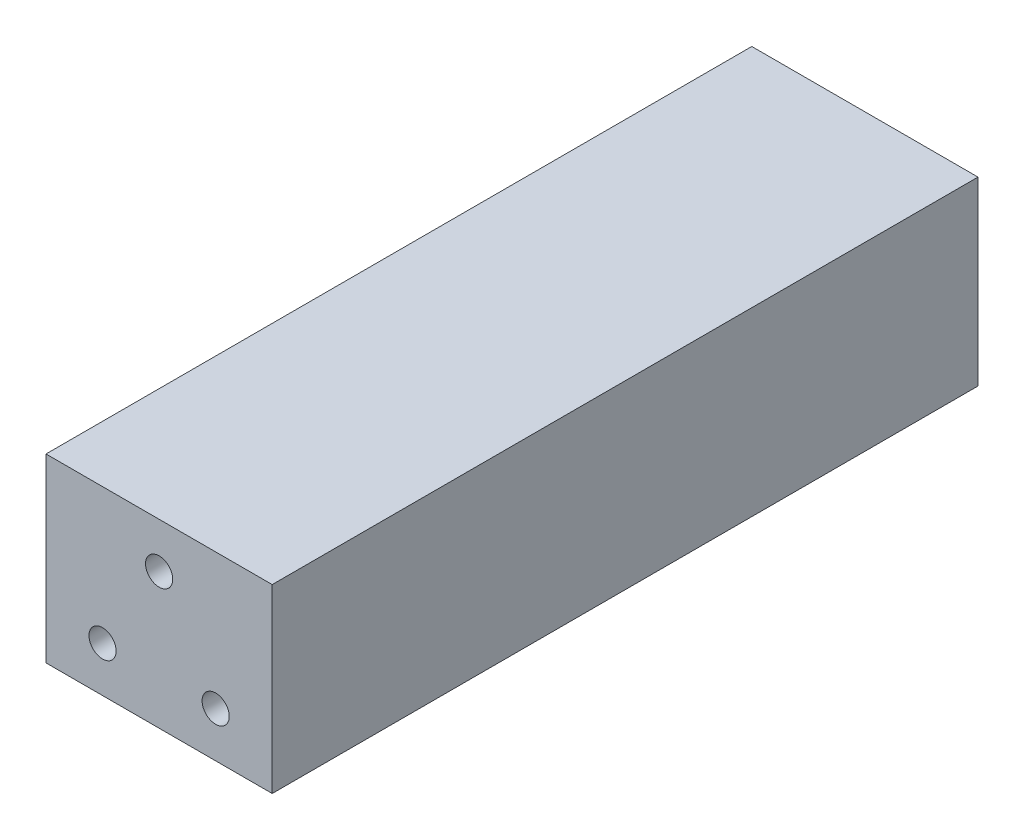
ISO-10303-21;
HEADER;
FILE_DESCRIPTION(('STEP AP214'),'2;1');
FILE_NAME('part.step','',(''),(''),'','','');
FILE_SCHEMA(('AUTOMOTIVE_DESIGN { 1 0 10303 214 1 1 1 1 }'));
ENDSEC;
DATA;
#1=APPLICATION_CONTEXT('core data for automotive mechanical design processes');
#2=APPLICATION_PROTOCOL_DEFINITION('international standard','automotive_design',2000,#1);
#3=PRODUCT_CONTEXT('',#1,'mechanical');
#4=PRODUCT('Part','Part','',(#3));
#5=PRODUCT_RELATED_PRODUCT_CATEGORY('part','',(#4));
#6=PRODUCT_DEFINITION_FORMATION('','',#4);
#7=PRODUCT_DEFINITION_CONTEXT('part definition',#1,'design');
#8=PRODUCT_DEFINITION('design','',#6,#7);
#9=PRODUCT_DEFINITION_SHAPE('','',#8);
#10=(LENGTH_UNIT() NAMED_UNIT(*) SI_UNIT(.MILLI.,.METRE.));
#11=(NAMED_UNIT(*) PLANE_ANGLE_UNIT() SI_UNIT($,.RADIAN.));
#12=(NAMED_UNIT(*) SI_UNIT($,.STERADIAN.) SOLID_ANGLE_UNIT());
#13=UNCERTAINTY_MEASURE_WITH_UNIT(LENGTH_MEASURE(1.E-05),#10,'distance_accuracy_value','');
#14=(GEOMETRIC_REPRESENTATION_CONTEXT(3) GLOBAL_UNCERTAINTY_ASSIGNED_CONTEXT((#13)) GLOBAL_UNIT_ASSIGNED_CONTEXT((#10,
#11,#12)) REPRESENTATION_CONTEXT('',''));
#15=CARTESIAN_POINT('',(0.,0.,0.));
#16=DIRECTION('',(0.,0.,1.));
#17=DIRECTION('',(1.,0.,0.));
#18=AXIS2_PLACEMENT_3D('',#15,#16,#17);
#19=CARTESIAN_POINT('',(0.,0.,78.0000000000001));
#20=DIRECTION('',(1.,0.,0.));
#21=DIRECTION('',(0.,1.,0.));
#22=AXIS2_PLACEMENT_3D('',#19,#20,#21);
#23=PLANE('',#22);
#24=DIRECTION('',(0.,-1.,0.));
#25=VECTOR('',#24,1.);
#26=CARTESIAN_POINT('',(0.,0.,0.));
#27=LINE('',#26,#25);
#28=CARTESIAN_POINT('',(0.,0.,0.));
#29=VERTEX_POINT('',#28);
#30=CARTESIAN_POINT('',(0.,-20.,0.));
#31=VERTEX_POINT('',#30);
#32=EDGE_CURVE('E98',#29,#31,#27,.T.);
#33=ORIENTED_EDGE('',*,*,#32,.T.);
#34=DIRECTION('',(0.,0.,-1.));
#35=VECTOR('',#34,1.);
#36=CARTESIAN_POINT('',(0.,-20.,78.0000000000001));
#37=LINE('',#36,#35);
#38=CARTESIAN_POINT('',(0.,-20.,78.0000000000001));
#39=VERTEX_POINT('',#38);
#40=EDGE_CURVE('E11',#39,#31,#37,.T.);
#41=ORIENTED_EDGE('',*,*,#40,.F.);
#42=DIRECTION('',(0.,-1.,0.));
#43=VECTOR('',#42,1.);
#44=CARTESIAN_POINT('',(0.,0.,78.0000000000001));
#45=LINE('',#44,#43);
#46=CARTESIAN_POINT('',(0.,0.,78.0000000000001));
#47=VERTEX_POINT('',#46);
#48=EDGE_CURVE('E86',#47,#39,#45,.T.);
#49=ORIENTED_EDGE('',*,*,#48,.F.);
#50=DIRECTION('',(0.,0.,-1.));
#51=VECTOR('',#50,1.);
#52=CARTESIAN_POINT('',(0.,0.,78.0000000000001));
#53=LINE('',#52,#51);
#54=EDGE_CURVE('E94',#47,#29,#53,.T.);
#55=ORIENTED_EDGE('',*,*,#54,.T.);
#56=EDGE_LOOP('',(#33,#41,#49,#55));
#57=FACE_BOUND('',#56,.T.);
#58=ADVANCED_FACE('F35',(#57),#23,.F.);
#59=CARTESIAN_POINT('',(0.,-20.,78.0000000000001));
#60=DIRECTION('',(0.,1.,0.));
#61=DIRECTION('',(0.,0.,1.));
#62=AXIS2_PLACEMENT_3D('',#59,#60,#61);
#63=PLANE('',#62);
#64=DIRECTION('',(1.,0.,0.));
#65=VECTOR('',#64,1.);
#66=CARTESIAN_POINT('',(0.,-20.,0.));
#67=LINE('',#66,#65);
#68=CARTESIAN_POINT('',(25.,-20.,0.));
#69=VERTEX_POINT('',#68);
#70=EDGE_CURVE('E90',#31,#69,#67,.T.);
#71=ORIENTED_EDGE('',*,*,#70,.T.);
#72=DIRECTION('',(0.,0.,-1.));
#73=VECTOR('',#72,1.);
#74=CARTESIAN_POINT('',(25.,-20.,78.0000000000001));
#75=LINE('',#74,#73);
#76=CARTESIAN_POINT('',(25.,-20.,78.0000000000001));
#77=VERTEX_POINT('',#76);
#78=EDGE_CURVE('E43',#77,#69,#75,.T.);
#79=ORIENTED_EDGE('',*,*,#78,.F.);
#80=DIRECTION('',(1.,0.,0.));
#81=VECTOR('',#80,1.);
#82=CARTESIAN_POINT('',(0.,-20.,78.0000000000001));
#83=LINE('',#82,#81);
#84=EDGE_CURVE('E81',#39,#77,#83,.T.);
#85=ORIENTED_EDGE('',*,*,#84,.F.);
#86=ORIENTED_EDGE('',*,*,#40,.T.);
#87=EDGE_LOOP('',(#71,#79,#85,#86));
#88=FACE_BOUND('',#87,.T.);
#89=ADVANCED_FACE('F89',(#88),#63,.F.);
#90=CARTESIAN_POINT('',(25.,0.,78.0000000000001));
#91=DIRECTION('',(-1.,0.,0.));
#92=DIRECTION('',(0.,0.,1.));
#93=AXIS2_PLACEMENT_3D('',#90,#91,#92);
#94=PLANE('',#93);
#95=DIRECTION('',(0.,1.,0.));
#96=VECTOR('',#95,1.);
#97=CARTESIAN_POINT('',(25.,0.,0.));
#98=LINE('',#97,#96);
#99=CARTESIAN_POINT('',(25.,0.,0.));
#100=VERTEX_POINT('',#99);
#101=EDGE_CURVE('E68',#69,#100,#98,.T.);
#102=ORIENTED_EDGE('',*,*,#101,.T.);
#103=DIRECTION('',(0.,0.,-1.));
#104=VECTOR('',#103,1.);
#105=CARTESIAN_POINT('',(25.,0.,78.0000000000001));
#106=LINE('',#105,#104);
#107=CARTESIAN_POINT('',(25.,0.,78.0000000000001));
#108=VERTEX_POINT('',#107);
#109=EDGE_CURVE('E91',#108,#100,#106,.T.);
#110=ORIENTED_EDGE('',*,*,#109,.F.);
#111=DIRECTION('',(0.,1.,0.));
#112=VECTOR('',#111,1.);
#113=CARTESIAN_POINT('',(25.,0.,78.0000000000001));
#114=LINE('',#113,#112);
#115=EDGE_CURVE('E84',#77,#108,#114,.T.);
#116=ORIENTED_EDGE('',*,*,#115,.F.);
#117=ORIENTED_EDGE('',*,*,#78,.T.);
#118=EDGE_LOOP('',(#102,#110,#116,#117));
#119=FACE_BOUND('',#118,.T.);
#120=ADVANCED_FACE('F92',(#119),#94,.F.);
#121=CARTESIAN_POINT('',(0.,0.,78.0000000000001));
#122=DIRECTION('',(0.,-1.,0.));
#123=DIRECTION('',(0.,0.,-1.));
#124=AXIS2_PLACEMENT_3D('',#121,#122,#123);
#125=PLANE('',#124);
#126=DIRECTION('',(-1.,0.,0.));
#127=VECTOR('',#126,1.);
#128=CARTESIAN_POINT('',(0.,0.,0.));
#129=LINE('',#128,#127);
#130=EDGE_CURVE('E74',#100,#29,#129,.T.);
#131=ORIENTED_EDGE('',*,*,#130,.T.);
#132=ORIENTED_EDGE('',*,*,#54,.F.);
#133=DIRECTION('',(-1.,0.,0.));
#134=VECTOR('',#133,1.);
#135=CARTESIAN_POINT('',(0.,0.,78.0000000000001));
#136=LINE('',#135,#134);
#137=EDGE_CURVE('E51',#108,#47,#136,.T.);
#138=ORIENTED_EDGE('',*,*,#137,.F.);
#139=ORIENTED_EDGE('',*,*,#109,.T.);
#140=EDGE_LOOP('',(#131,#132,#138,#139));
#141=FACE_BOUND('',#140,.T.);
#142=ADVANCED_FACE('F106',(#141),#125,.F.);
#143=CARTESIAN_POINT('',(0.,0.,78.0000000000001));
#144=DIRECTION('',(0.,0.,1.));
#145=DIRECTION('',(1.,0.,0.));
#146=AXIS2_PLACEMENT_3D('',#143,#144,#145);
#147=PLANE('',#146);
#148=CARTESIAN_POINT('',(12.5,-5.,78.0000000000001));
#149=DIRECTION('',(0.,0.,1.));
#150=DIRECTION('',(1.,0.,0.));
#151=AXIS2_PLACEMENT_3D('',#148,#149,#150);
#152=CIRCLE('',#151,1.5);
#153=CARTESIAN_POINT('',(14.,-5.,78.0000000000001));
#154=VERTEX_POINT('',#153);
#155=EDGE_CURVE('E125',#154,#154,#152,.T.);
#156=ORIENTED_EDGE('',*,*,#155,.F.);
#157=EDGE_LOOP('',(#156));
#158=FACE_BOUND('',#157,.T.);
#159=CARTESIAN_POINT('',(6.25,-15.,78.0000000000001));
#160=DIRECTION('',(0.,0.,1.));
#161=DIRECTION('',(1.,0.,0.));
#162=AXIS2_PLACEMENT_3D('',#159,#160,#161);
#163=CIRCLE('',#162,1.5);
#164=CARTESIAN_POINT('',(7.75,-15.,78.0000000000001));
#165=VERTEX_POINT('',#164);
#166=EDGE_CURVE('E119',#165,#165,#163,.T.);
#167=ORIENTED_EDGE('',*,*,#166,.F.);
#168=EDGE_LOOP('',(#167));
#169=FACE_BOUND('',#168,.T.);
#170=CARTESIAN_POINT('',(18.75,-15.,78.0000000000001));
#171=DIRECTION('',(0.,0.,1.));
#172=DIRECTION('',(1.,0.,0.));
#173=AXIS2_PLACEMENT_3D('',#170,#171,#172);
#174=CIRCLE('',#173,1.5);
#175=CARTESIAN_POINT('',(20.25,-15.,78.0000000000001));
#176=VERTEX_POINT('',#175);
#177=EDGE_CURVE('E112',#176,#176,#174,.T.);
#178=ORIENTED_EDGE('',*,*,#177,.F.);
#179=EDGE_LOOP('',(#178));
#180=FACE_BOUND('',#179,.T.);
#181=ORIENTED_EDGE('',*,*,#48,.T.);
#182=ORIENTED_EDGE('',*,*,#84,.T.);
#183=ORIENTED_EDGE('',*,*,#115,.T.);
#184=ORIENTED_EDGE('',*,*,#137,.T.);
#185=EDGE_LOOP('',(#181,#182,#183,#184));
#186=FACE_BOUND('',#185,.T.);
#187=ADVANCED_FACE('F82',(#158,#169,#180,#186),#147,.T.);
#188=CARTESIAN_POINT('',(0.,0.,0.));
#189=DIRECTION('',(0.,0.,1.));
#190=DIRECTION('',(1.,0.,0.));
#191=AXIS2_PLACEMENT_3D('',#188,#189,#190);
#192=PLANE('',#191);
#193=CARTESIAN_POINT('',(12.5,-5.,0.));
#194=DIRECTION('',(0.,0.,-1.));
#195=DIRECTION('',(-1.,0.,0.));
#196=AXIS2_PLACEMENT_3D('',#193,#194,#195);
#197=CIRCLE('',#196,1.48552314686929);
#198=CARTESIAN_POINT('',(11.0144768531307,-5.,0.));
#199=VERTEX_POINT('',#198);
#200=EDGE_CURVE('E142',#199,#199,#197,.T.);
#201=ORIENTED_EDGE('',*,*,#200,.F.);
#202=EDGE_LOOP('',(#201));
#203=FACE_BOUND('',#202,.T.);
#204=CARTESIAN_POINT('',(6.25,-15.,0.));
#205=DIRECTION('',(0.,0.,-1.));
#206=DIRECTION('',(-1.,0.,0.));
#207=AXIS2_PLACEMENT_3D('',#204,#205,#206);
#208=CIRCLE('',#207,1.54736061569707);
#209=CARTESIAN_POINT('',(4.70263938430293,-15.,0.));
#210=VERTEX_POINT('',#209);
#211=EDGE_CURVE('E136',#210,#210,#208,.T.);
#212=ORIENTED_EDGE('',*,*,#211,.F.);
#213=EDGE_LOOP('',(#212));
#214=FACE_BOUND('',#213,.T.);
#215=CARTESIAN_POINT('',(18.75,-15.,0.));
#216=DIRECTION('',(0.,0.,-1.));
#217=DIRECTION('',(-1.,0.,0.));
#218=AXIS2_PLACEMENT_3D('',#215,#216,#217);
#219=CIRCLE('',#218,1.49460031588074);
#220=CARTESIAN_POINT('',(17.2553996841193,-15.,0.));
#221=VERTEX_POINT('',#220);
#222=EDGE_CURVE('E130',#221,#221,#219,.T.);
#223=ORIENTED_EDGE('',*,*,#222,.F.);
#224=EDGE_LOOP('',(#223));
#225=FACE_BOUND('',#224,.T.);
#226=ORIENTED_EDGE('',*,*,#32,.F.);
#227=ORIENTED_EDGE('',*,*,#130,.F.);
#228=ORIENTED_EDGE('',*,*,#101,.F.);
#229=ORIENTED_EDGE('',*,*,#70,.F.);
#230=EDGE_LOOP('',(#226,#227,#228,#229));
#231=FACE_BOUND('',#230,.T.);
#232=ADVANCED_FACE('F109',(#203,#214,#225,#231),#192,.F.);
#233=CARTESIAN_POINT('',(18.75,-15.,68.));
#234=DIRECTION('',(0.,0.,1.));
#235=DIRECTION('',(1.,0.,0.));
#236=AXIS2_PLACEMENT_3D('',#233,#234,#235);
#237=CYLINDRICAL_SURFACE('',#236,1.5);
#238=CARTESIAN_POINT('',(18.75,-15.,68.));
#239=DIRECTION('',(0.,0.,1.));
#240=DIRECTION('',(1.,0.,0.));
#241=AXIS2_PLACEMENT_3D('',#238,#239,#240);
#242=CIRCLE('',#241,1.5);
#243=CARTESIAN_POINT('',(20.25,-15.,68.));
#244=VERTEX_POINT('',#243);
#245=EDGE_CURVE('E115',#244,#244,#242,.T.);
#246=ORIENTED_EDGE('',*,*,#245,.F.);
#247=EDGE_LOOP('',(#246));
#248=FACE_BOUND('',#247,.T.);
#249=ORIENTED_EDGE('',*,*,#177,.T.);
#250=EDGE_LOOP('',(#249));
#251=FACE_BOUND('',#250,.T.);
#252=ADVANCED_FACE('F159',(#248,#251),#237,.F.);
#253=CARTESIAN_POINT('',(18.75,-15.,68.));
#254=DIRECTION('',(0.,0.,1.));
#255=DIRECTION('',(1.,0.,0.));
#256=AXIS2_PLACEMENT_3D('',#253,#254,#255);
#257=PLANE('',#256);
#258=ORIENTED_EDGE('',*,*,#245,.T.);
#259=EDGE_LOOP('',(#258));
#260=FACE_BOUND('',#259,.T.);
#261=ADVANCED_FACE('F198',(#260),#257,.T.);
#262=CARTESIAN_POINT('',(6.25,-15.,68.));
#263=DIRECTION('',(0.,0.,1.));
#264=DIRECTION('',(1.,0.,0.));
#265=AXIS2_PLACEMENT_3D('',#262,#263,#264);
#266=CYLINDRICAL_SURFACE('',#265,1.5);
#267=CARTESIAN_POINT('',(6.25,-15.,68.));
#268=DIRECTION('',(0.,0.,1.));
#269=DIRECTION('',(1.,0.,0.));
#270=AXIS2_PLACEMENT_3D('',#267,#268,#269);
#271=CIRCLE('',#270,1.5);
#272=CARTESIAN_POINT('',(7.75,-15.,68.));
#273=VERTEX_POINT('',#272);
#274=EDGE_CURVE('E122',#273,#273,#271,.T.);
#275=ORIENTED_EDGE('',*,*,#274,.F.);
#276=EDGE_LOOP('',(#275));
#277=FACE_BOUND('',#276,.T.);
#278=ORIENTED_EDGE('',*,*,#166,.T.);
#279=EDGE_LOOP('',(#278));
#280=FACE_BOUND('',#279,.T.);
#281=ADVANCED_FACE('F202',(#277,#280),#266,.F.);
#282=CARTESIAN_POINT('',(6.25,-15.,68.));
#283=DIRECTION('',(0.,0.,1.));
#284=DIRECTION('',(1.,0.,0.));
#285=AXIS2_PLACEMENT_3D('',#282,#283,#284);
#286=PLANE('',#285);
#287=ORIENTED_EDGE('',*,*,#274,.T.);
#288=EDGE_LOOP('',(#287));
#289=FACE_BOUND('',#288,.T.);
#290=ADVANCED_FACE('F206',(#289),#286,.T.);
#291=CARTESIAN_POINT('',(12.5,-5.,68.));
#292=DIRECTION('',(0.,0.,1.));
#293=DIRECTION('',(1.,0.,0.));
#294=AXIS2_PLACEMENT_3D('',#291,#292,#293);
#295=CYLINDRICAL_SURFACE('',#294,1.5);
#296=CARTESIAN_POINT('',(12.5,-5.,68.));
#297=DIRECTION('',(0.,0.,1.));
#298=DIRECTION('',(1.,0.,0.));
#299=AXIS2_PLACEMENT_3D('',#296,#297,#298);
#300=CIRCLE('',#299,1.5);
#301=CARTESIAN_POINT('',(14.,-5.,68.));
#302=VERTEX_POINT('',#301);
#303=EDGE_CURVE('E101',#302,#302,#300,.T.);
#304=ORIENTED_EDGE('',*,*,#303,.F.);
#305=EDGE_LOOP('',(#304));
#306=FACE_BOUND('',#305,.T.);
#307=ORIENTED_EDGE('',*,*,#155,.T.);
#308=EDGE_LOOP('',(#307));
#309=FACE_BOUND('',#308,.T.);
#310=ADVANCED_FACE('F178',(#306,#309),#295,.F.);
#311=CARTESIAN_POINT('',(12.5,-5.,68.));
#312=DIRECTION('',(0.,0.,1.));
#313=DIRECTION('',(1.,0.,0.));
#314=AXIS2_PLACEMENT_3D('',#311,#312,#313);
#315=PLANE('',#314);
#316=ORIENTED_EDGE('',*,*,#303,.T.);
#317=EDGE_LOOP('',(#316));
#318=FACE_BOUND('',#317,.T.);
#319=ADVANCED_FACE('F168',(#318),#315,.T.);
#320=CARTESIAN_POINT('',(18.75,-15.,10.0000000000001));
#321=DIRECTION('',(0.,0.,-1.));
#322=DIRECTION('',(-1.,0.,0.));
#323=AXIS2_PLACEMENT_3D('',#320,#321,#322);
#324=CYLINDRICAL_SURFACE('',#323,1.49460031588074);
#325=CARTESIAN_POINT('',(18.75,-15.,10.0000000000001));
#326=DIRECTION('',(0.,0.,-1.));
#327=DIRECTION('',(-1.,0.,0.));
#328=AXIS2_PLACEMENT_3D('',#325,#326,#327);
#329=CIRCLE('',#328,1.49460031588074);
#330=CARTESIAN_POINT('',(17.2553996841193,-15.,10.0000000000001));
#331=VERTEX_POINT('',#330);
#332=EDGE_CURVE('E133',#331,#331,#329,.T.);
#333=ORIENTED_EDGE('',*,*,#332,.F.);
#334=EDGE_LOOP('',(#333));
#335=FACE_BOUND('',#334,.T.);
#336=ORIENTED_EDGE('',*,*,#222,.T.);
#337=EDGE_LOOP('',(#336));
#338=FACE_BOUND('',#337,.T.);
#339=ADVANCED_FACE('F165',(#335,#338),#324,.F.);
#340=CARTESIAN_POINT('',(18.75,-15.,10.0000000000001));
#341=DIRECTION('',(0.,0.,-1.));
#342=DIRECTION('',(-1.,0.,0.));
#343=AXIS2_PLACEMENT_3D('',#340,#341,#342);
#344=PLANE('',#343);
#345=ORIENTED_EDGE('',*,*,#332,.T.);
#346=EDGE_LOOP('',(#345));
#347=FACE_BOUND('',#346,.T.);
#348=ADVANCED_FACE('F167',(#347),#344,.T.);
#349=CARTESIAN_POINT('',(6.25,-15.,10.0000000000001));
#350=DIRECTION('',(0.,0.,-1.));
#351=DIRECTION('',(-1.,0.,0.));
#352=AXIS2_PLACEMENT_3D('',#349,#350,#351);
#353=CYLINDRICAL_SURFACE('',#352,1.54736061569707);
#354=CARTESIAN_POINT('',(6.25,-15.,10.0000000000001));
#355=DIRECTION('',(0.,0.,-1.));
#356=DIRECTION('',(-1.,0.,0.));
#357=AXIS2_PLACEMENT_3D('',#354,#355,#356);
#358=CIRCLE('',#357,1.54736061569707);
#359=CARTESIAN_POINT('',(4.70263938430293,-15.,10.0000000000001));
#360=VERTEX_POINT('',#359);
#361=EDGE_CURVE('E139',#360,#360,#358,.T.);
#362=ORIENTED_EDGE('',*,*,#361,.F.);
#363=EDGE_LOOP('',(#362));
#364=FACE_BOUND('',#363,.T.);
#365=ORIENTED_EDGE('',*,*,#211,.T.);
#366=EDGE_LOOP('',(#365));
#367=FACE_BOUND('',#366,.T.);
#368=ADVANCED_FACE('F175',(#364,#367),#353,.F.);
#369=CARTESIAN_POINT('',(6.25,-15.,10.0000000000001));
#370=DIRECTION('',(0.,0.,-1.));
#371=DIRECTION('',(-1.,0.,0.));
#372=AXIS2_PLACEMENT_3D('',#369,#370,#371);
#373=PLANE('',#372);
#374=ORIENTED_EDGE('',*,*,#361,.T.);
#375=EDGE_LOOP('',(#374));
#376=FACE_BOUND('',#375,.T.);
#377=ADVANCED_FACE('F153',(#376),#373,.T.);
#378=CARTESIAN_POINT('',(12.5,-5.,10.0000000000001));
#379=DIRECTION('',(0.,0.,-1.));
#380=DIRECTION('',(-1.,0.,0.));
#381=AXIS2_PLACEMENT_3D('',#378,#379,#380);
#382=CYLINDRICAL_SURFACE('',#381,1.48552314686929);
#383=CARTESIAN_POINT('',(12.5,-5.,10.0000000000001));
#384=DIRECTION('',(0.,0.,-1.));
#385=DIRECTION('',(-1.,0.,0.));
#386=AXIS2_PLACEMENT_3D('',#383,#384,#385);
#387=CIRCLE('',#386,1.48552314686929);
#388=CARTESIAN_POINT('',(11.0144768531307,-5.,10.0000000000001));
#389=VERTEX_POINT('',#388);
#390=EDGE_CURVE('E116',#389,#389,#387,.T.);
#391=ORIENTED_EDGE('',*,*,#390,.F.);
#392=EDGE_LOOP('',(#391));
#393=FACE_BOUND('',#392,.T.);
#394=ORIENTED_EDGE('',*,*,#200,.T.);
#395=EDGE_LOOP('',(#394));
#396=FACE_BOUND('',#395,.T.);
#397=ADVANCED_FACE('F150',(#393,#396),#382,.F.);
#398=CARTESIAN_POINT('',(12.5,-5.,10.0000000000001));
#399=DIRECTION('',(0.,0.,-1.));
#400=DIRECTION('',(-1.,0.,0.));
#401=AXIS2_PLACEMENT_3D('',#398,#399,#400);
#402=PLANE('',#401);
#403=ORIENTED_EDGE('',*,*,#390,.T.);
#404=EDGE_LOOP('',(#403));
#405=FACE_BOUND('',#404,.T.);
#406=ADVANCED_FACE('F148',(#405),#402,.T.);
#407=CLOSED_SHELL('',(#58,#89,#120,#142,#187,#232,#252,#261,#281,#290,#310,#319,#339,#348,#368,
#377,#397,#406));
#408=MANIFOLD_SOLID_BREP('B2',#407);
#409=ADVANCED_BREP_SHAPE_REPRESENTATION('',(#18,#408),#14);
#410=SHAPE_DEFINITION_REPRESENTATION(#9,#409);
ENDSEC;
END-ISO-10303-21;
